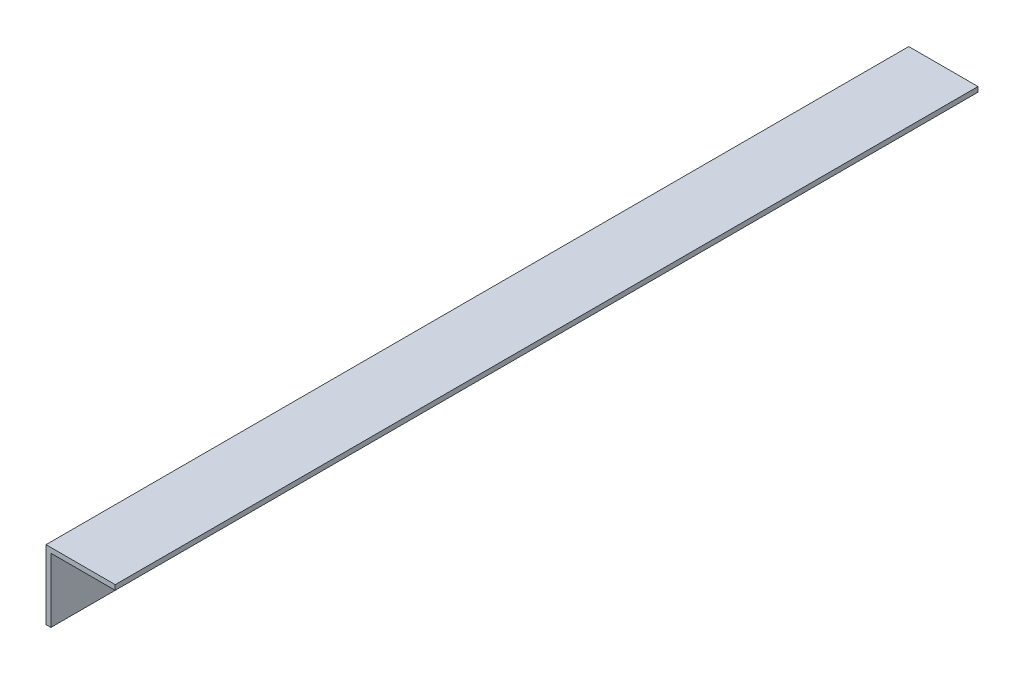
ISO-10303-21;
HEADER;
FILE_DESCRIPTION(('STEP AP214'),'2;1');
FILE_NAME('part.step','',(''),(''),'','','');
FILE_SCHEMA(('AUTOMOTIVE_DESIGN { 1 0 10303 214 1 1 1 1 }'));
ENDSEC;
DATA;
#1=APPLICATION_CONTEXT('core data for automotive mechanical design processes');
#2=APPLICATION_PROTOCOL_DEFINITION('international standard','automotive_design',2000,#1);
#3=PRODUCT_CONTEXT('',#1,'mechanical');
#4=PRODUCT('Part','Part','',(#3));
#5=PRODUCT_RELATED_PRODUCT_CATEGORY('part','',(#4));
#6=PRODUCT_DEFINITION_FORMATION('','',#4);
#7=PRODUCT_DEFINITION_CONTEXT('part definition',#1,'design');
#8=PRODUCT_DEFINITION('design','',#6,#7);
#9=PRODUCT_DEFINITION_SHAPE('','',#8);
#10=(LENGTH_UNIT() NAMED_UNIT(*) SI_UNIT(.MILLI.,.METRE.));
#11=(NAMED_UNIT(*) PLANE_ANGLE_UNIT() SI_UNIT($,.RADIAN.));
#12=(NAMED_UNIT(*) SI_UNIT($,.STERADIAN.) SOLID_ANGLE_UNIT());
#13=UNCERTAINTY_MEASURE_WITH_UNIT(LENGTH_MEASURE(1.E-05),#10,'distance_accuracy_value','');
#14=(GEOMETRIC_REPRESENTATION_CONTEXT(3) GLOBAL_UNCERTAINTY_ASSIGNED_CONTEXT((#13)) GLOBAL_UNIT_ASSIGNED_CONTEXT((#10,
#11,#12)) REPRESENTATION_CONTEXT('',''));
#15=CARTESIAN_POINT('',(0.,0.,0.));
#16=DIRECTION('',(0.,0.,1.));
#17=DIRECTION('',(1.,0.,0.));
#18=AXIS2_PLACEMENT_3D('',#15,#16,#17);
#19=CARTESIAN_POINT('',(0.,0.,1107.6));
#20=DIRECTION('',(1.,0.,0.));
#21=DIRECTION('',(0.,1.,0.));
#22=AXIS2_PLACEMENT_3D('',#19,#20,#21);
#23=PLANE('',#22);
#24=DIRECTION('',(0.,-1.,0.));
#25=VECTOR('',#24,1.);
#26=CARTESIAN_POINT('',(0.,0.,0.));
#27=LINE('',#26,#25);
#28=CARTESIAN_POINT('',(0.,0.,0.));
#29=VERTEX_POINT('',#28);
#30=CARTESIAN_POINT('',(0.,-88.9,0.));
#31=VERTEX_POINT('',#30);
#32=EDGE_CURVE('E120',#29,#31,#27,.T.);
#33=ORIENTED_EDGE('',*,*,#32,.T.);
#34=DIRECTION('',(0.,0.,-1.));
#35=VECTOR('',#34,1.);
#36=CARTESIAN_POINT('',(0.,-88.9,1107.6));
#37=LINE('',#36,#35);
#38=CARTESIAN_POINT('',(0.,-88.9,1107.6));
#39=VERTEX_POINT('',#38);
#40=EDGE_CURVE('E11',#39,#31,#37,.T.);
#41=ORIENTED_EDGE('',*,*,#40,.F.);
#42=DIRECTION('',(0.,-1.,0.));
#43=VECTOR('',#42,1.);
#44=CARTESIAN_POINT('',(0.,0.,1107.6));
#45=LINE('',#44,#43);
#46=CARTESIAN_POINT('',(0.,0.,1107.6));
#47=VERTEX_POINT('',#46);
#48=EDGE_CURVE('E130',#47,#39,#45,.T.);
#49=ORIENTED_EDGE('',*,*,#48,.F.);
#50=DIRECTION('',(0.,0.,-1.));
#51=VECTOR('',#50,1.);
#52=CARTESIAN_POINT('',(0.,0.,1107.6));
#53=LINE('',#52,#51);
#54=EDGE_CURVE('E116',#47,#29,#53,.T.);
#55=ORIENTED_EDGE('',*,*,#54,.T.);
#56=EDGE_LOOP('',(#33,#41,#49,#55));
#57=FACE_BOUND('',#56,.T.);
#58=ADVANCED_FACE('F36',(#57),#23,.F.);
#59=CARTESIAN_POINT('',(6.35000000000001,-88.9,1107.6));
#60=DIRECTION('',(0.,1.,0.));
#61=DIRECTION('',(0.,0.,1.));
#62=AXIS2_PLACEMENT_3D('',#59,#60,#61);
#63=PLANE('',#62);
#64=DIRECTION('',(1.,0.,0.));
#65=VECTOR('',#64,1.);
#66=CARTESIAN_POINT('',(6.35000000000001,-88.9,0.));
#67=LINE('',#66,#65);
#68=CARTESIAN_POINT('',(6.35000000000001,-88.9,0.));
#69=VERTEX_POINT('',#68);
#70=EDGE_CURVE('E123',#31,#69,#67,.T.);
#71=ORIENTED_EDGE('',*,*,#70,.T.);
#72=DIRECTION('',(0.,0.,-1.));
#73=VECTOR('',#72,1.);
#74=CARTESIAN_POINT('',(6.35000000000001,-88.9,1107.6));
#75=LINE('',#74,#73);
#76=CARTESIAN_POINT('',(6.35000000000001,-88.9,1107.6));
#77=VERTEX_POINT('',#76);
#78=EDGE_CURVE('E44',#77,#69,#75,.T.);
#79=ORIENTED_EDGE('',*,*,#78,.F.);
#80=DIRECTION('',(1.,0.,0.));
#81=VECTOR('',#80,1.);
#82=CARTESIAN_POINT('',(6.35000000000001,-88.9,1107.6));
#83=LINE('',#82,#81);
#84=EDGE_CURVE('E89',#39,#77,#83,.T.);
#85=ORIENTED_EDGE('',*,*,#84,.F.);
#86=ORIENTED_EDGE('',*,*,#40,.T.);
#87=EDGE_LOOP('',(#71,#79,#85,#86));
#88=FACE_BOUND('',#87,.T.);
#89=ADVANCED_FACE('F154',(#88),#63,.F.);
#90=CARTESIAN_POINT('',(6.35,-6.35,1107.6));
#91=DIRECTION('',(-1.,0.,0.));
#92=DIRECTION('',(0.,-1.,0.));
#93=AXIS2_PLACEMENT_3D('',#90,#91,#92);
#94=PLANE('',#93);
#95=DIRECTION('',(0.,1.,0.));
#96=VECTOR('',#95,1.);
#97=CARTESIAN_POINT('',(6.35,-6.35,0.));
#98=LINE('',#97,#96);
#99=CARTESIAN_POINT('',(6.35,-6.35,0.));
#100=VERTEX_POINT('',#99);
#101=EDGE_CURVE('E125',#69,#100,#98,.T.);
#102=ORIENTED_EDGE('',*,*,#101,.T.);
#103=DIRECTION('',(0.,0.,-1.));
#104=VECTOR('',#103,1.);
#105=CARTESIAN_POINT('',(6.35,-6.35,1107.6));
#106=LINE('',#105,#104);
#107=CARTESIAN_POINT('',(6.35,-6.35,1107.6));
#108=VERTEX_POINT('',#107);
#109=EDGE_CURVE('E111',#108,#100,#106,.T.);
#110=ORIENTED_EDGE('',*,*,#109,.F.);
#111=DIRECTION('',(0.,1.,0.));
#112=VECTOR('',#111,1.);
#113=CARTESIAN_POINT('',(6.35,-6.35,1107.6));
#114=LINE('',#113,#112);
#115=EDGE_CURVE('E102',#77,#108,#114,.T.);
#116=ORIENTED_EDGE('',*,*,#115,.F.);
#117=ORIENTED_EDGE('',*,*,#78,.T.);
#118=EDGE_LOOP('',(#102,#110,#116,#117));
#119=FACE_BOUND('',#118,.T.);
#120=ADVANCED_FACE('F136',(#119),#94,.F.);
#121=CARTESIAN_POINT('',(6.35,-6.35,1107.6));
#122=DIRECTION('',(0.,1.,0.));
#123=DIRECTION('',(0.,0.,1.));
#124=AXIS2_PLACEMENT_3D('',#121,#122,#123);
#125=PLANE('',#124);
#126=DIRECTION('',(1.,0.,0.));
#127=VECTOR('',#126,1.);
#128=CARTESIAN_POINT('',(6.35,-6.35,0.));
#129=LINE('',#128,#127);
#130=CARTESIAN_POINT('',(88.9,-6.35,0.));
#131=VERTEX_POINT('',#130);
#132=EDGE_CURVE('E110',#100,#131,#129,.T.);
#133=ORIENTED_EDGE('',*,*,#132,.T.);
#134=DIRECTION('',(0.,0.,-1.));
#135=VECTOR('',#134,1.);
#136=CARTESIAN_POINT('',(88.9,-6.35,1107.6));
#137=LINE('',#136,#135);
#138=CARTESIAN_POINT('',(88.9,-6.35,1107.6));
#139=VERTEX_POINT('',#138);
#140=EDGE_CURVE('E107',#139,#131,#137,.T.);
#141=ORIENTED_EDGE('',*,*,#140,.F.);
#142=DIRECTION('',(1.,0.,0.));
#143=VECTOR('',#142,1.);
#144=CARTESIAN_POINT('',(6.35,-6.35,1107.6));
#145=LINE('',#144,#143);
#146=EDGE_CURVE('E96',#108,#139,#145,.T.);
#147=ORIENTED_EDGE('',*,*,#146,.F.);
#148=ORIENTED_EDGE('',*,*,#109,.T.);
#149=EDGE_LOOP('',(#133,#141,#147,#148));
#150=FACE_BOUND('',#149,.T.);
#151=ADVANCED_FACE('F108',(#150),#125,.F.);
#152=CARTESIAN_POINT('',(88.9,-6.35,1107.6));
#153=DIRECTION('',(-1.,0.,0.));
#154=DIRECTION('',(0.,0.,1.));
#155=AXIS2_PLACEMENT_3D('',#152,#153,#154);
#156=PLANE('',#155);
#157=DIRECTION('',(0.,1.,0.));
#158=VECTOR('',#157,1.);
#159=CARTESIAN_POINT('',(88.9,-6.35,0.));
#160=LINE('',#159,#158);
#161=CARTESIAN_POINT('',(88.9,0.,0.));
#162=VERTEX_POINT('',#161);
#163=EDGE_CURVE('E75',#131,#162,#160,.T.);
#164=ORIENTED_EDGE('',*,*,#163,.T.);
#165=DIRECTION('',(0.,0.,-1.));
#166=VECTOR('',#165,1.);
#167=CARTESIAN_POINT('',(88.9,0.,1107.6));
#168=LINE('',#167,#166);
#169=CARTESIAN_POINT('',(88.9,0.,1107.6));
#170=VERTEX_POINT('',#169);
#171=EDGE_CURVE('E112',#170,#162,#168,.T.);
#172=ORIENTED_EDGE('',*,*,#171,.F.);
#173=DIRECTION('',(0.,1.,0.));
#174=VECTOR('',#173,1.);
#175=CARTESIAN_POINT('',(88.9,-6.35,1107.6));
#176=LINE('',#175,#174);
#177=EDGE_CURVE('E100',#139,#170,#176,.T.);
#178=ORIENTED_EDGE('',*,*,#177,.F.);
#179=ORIENTED_EDGE('',*,*,#140,.T.);
#180=EDGE_LOOP('',(#164,#172,#178,#179));
#181=FACE_BOUND('',#180,.T.);
#182=ADVANCED_FACE('F114',(#181),#156,.F.);
#183=CARTESIAN_POINT('',(0.,0.,1107.6));
#184=DIRECTION('',(0.,-1.,0.));
#185=DIRECTION('',(0.,0.,-1.));
#186=AXIS2_PLACEMENT_3D('',#183,#184,#185);
#187=PLANE('',#186);
#188=DIRECTION('',(-1.,0.,0.));
#189=VECTOR('',#188,1.);
#190=CARTESIAN_POINT('',(0.,0.,0.));
#191=LINE('',#190,#189);
#192=EDGE_CURVE('E81',#162,#29,#191,.T.);
#193=ORIENTED_EDGE('',*,*,#192,.T.);
#194=ORIENTED_EDGE('',*,*,#54,.F.);
#195=DIRECTION('',(-1.,0.,0.));
#196=VECTOR('',#195,1.);
#197=CARTESIAN_POINT('',(0.,0.,1107.6));
#198=LINE('',#197,#196);
#199=EDGE_CURVE('E52',#170,#47,#198,.T.);
#200=ORIENTED_EDGE('',*,*,#199,.F.);
#201=ORIENTED_EDGE('',*,*,#171,.T.);
#202=EDGE_LOOP('',(#193,#194,#200,#201));
#203=FACE_BOUND('',#202,.T.);
#204=ADVANCED_FACE('F143',(#203),#187,.F.);
#205=CARTESIAN_POINT('',(0.,0.,1107.6));
#206=DIRECTION('',(0.,0.,-1.));
#207=DIRECTION('',(-1.,0.,0.));
#208=AXIS2_PLACEMENT_3D('',#205,#206,#207);
#209=PLANE('',#208);
#210=ORIENTED_EDGE('',*,*,#48,.T.);
#211=ORIENTED_EDGE('',*,*,#84,.T.);
#212=ORIENTED_EDGE('',*,*,#115,.T.);
#213=ORIENTED_EDGE('',*,*,#146,.T.);
#214=ORIENTED_EDGE('',*,*,#177,.T.);
#215=ORIENTED_EDGE('',*,*,#199,.T.);
#216=EDGE_LOOP('',(#210,#211,#212,#213,#214,#215));
#217=FACE_BOUND('',#216,.T.);
#218=ADVANCED_FACE('F98',(#217),#209,.F.);
#219=CARTESIAN_POINT('',(0.,0.,0.));
#220=DIRECTION('',(0.,0.,-1.));
#221=DIRECTION('',(-1.,0.,0.));
#222=AXIS2_PLACEMENT_3D('',#219,#220,#221);
#223=PLANE('',#222);
#224=ORIENTED_EDGE('',*,*,#32,.F.);
#225=ORIENTED_EDGE('',*,*,#192,.F.);
#226=ORIENTED_EDGE('',*,*,#163,.F.);
#227=ORIENTED_EDGE('',*,*,#132,.F.);
#228=ORIENTED_EDGE('',*,*,#101,.F.);
#229=ORIENTED_EDGE('',*,*,#70,.F.);
#230=EDGE_LOOP('',(#224,#225,#226,#227,#228,#229));
#231=FACE_BOUND('',#230,.T.);
#232=ADVANCED_FACE('F139',(#231),#223,.T.);
#233=CLOSED_SHELL('',(#58,#89,#120,#151,#182,#204,#218,#232));
#234=MANIFOLD_SOLID_BREP('B2',#233);
#235=ADVANCED_BREP_SHAPE_REPRESENTATION('',(#18,#234),#14);
#236=SHAPE_DEFINITION_REPRESENTATION(#9,#235);
ENDSEC;
END-ISO-10303-21;
